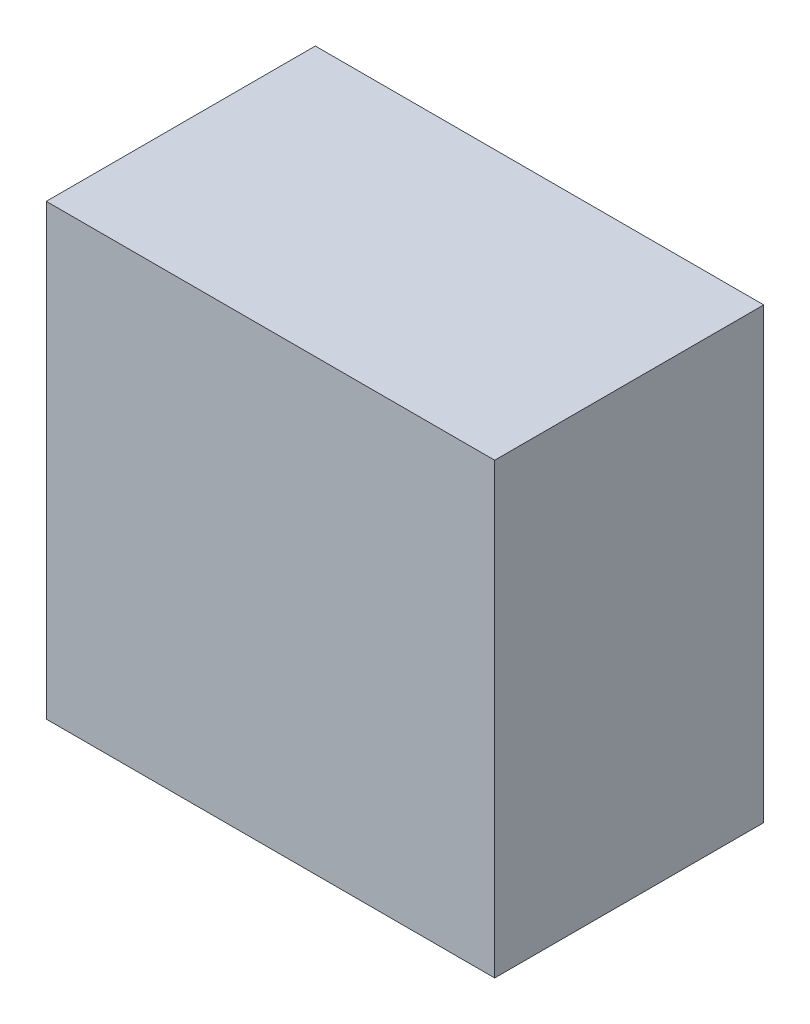
ISO-10303-21;
HEADER;
FILE_DESCRIPTION(('STEP AP214'),'2;1');
FILE_NAME('part.step','',(''),(''),'','','');
FILE_SCHEMA(('AUTOMOTIVE_DESIGN { 1 0 10303 214 1 1 1 1 }'));
ENDSEC;
DATA;
#1=APPLICATION_CONTEXT('core data for automotive mechanical design processes');
#2=APPLICATION_PROTOCOL_DEFINITION('international standard','automotive_design',2000,#1);
#3=PRODUCT_CONTEXT('',#1,'mechanical');
#4=PRODUCT('Part','Part','',(#3));
#5=PRODUCT_RELATED_PRODUCT_CATEGORY('part','',(#4));
#6=PRODUCT_DEFINITION_FORMATION('','',#4);
#7=PRODUCT_DEFINITION_CONTEXT('part definition',#1,'design');
#8=PRODUCT_DEFINITION('design','',#6,#7);
#9=PRODUCT_DEFINITION_SHAPE('','',#8);
#10=(LENGTH_UNIT() NAMED_UNIT(*) SI_UNIT(.MILLI.,.METRE.));
#11=(NAMED_UNIT(*) PLANE_ANGLE_UNIT() SI_UNIT($,.RADIAN.));
#12=(NAMED_UNIT(*) SI_UNIT($,.STERADIAN.) SOLID_ANGLE_UNIT());
#13=UNCERTAINTY_MEASURE_WITH_UNIT(LENGTH_MEASURE(1.E-05),#10,'distance_accuracy_value','');
#14=(GEOMETRIC_REPRESENTATION_CONTEXT(3) GLOBAL_UNCERTAINTY_ASSIGNED_CONTEXT((#13)) GLOBAL_UNIT_ASSIGNED_CONTEXT((#10,
#11,#12)) REPRESENTATION_CONTEXT('',''));
#15=CARTESIAN_POINT('',(0.,0.,0.));
#16=DIRECTION('',(0.,0.,1.));
#17=DIRECTION('',(1.,0.,0.));
#18=AXIS2_PLACEMENT_3D('',#15,#16,#17);
#19=CARTESIAN_POINT('',(37.5,37.5,22.5));
#20=DIRECTION('',(-1.,0.,0.));
#21=DIRECTION('',(0.,-1.,0.));
#22=AXIS2_PLACEMENT_3D('',#19,#20,#21);
#23=PLANE('',#22);
#24=DIRECTION('',(0.,1.,0.));
#25=VECTOR('',#24,1.);
#26=CARTESIAN_POINT('',(37.5,37.5,-22.5));
#27=LINE('',#26,#25);
#28=CARTESIAN_POINT('',(37.5,-37.5,-22.5));
#29=VERTEX_POINT('',#28);
#30=CARTESIAN_POINT('',(37.5,37.5,-22.5));
#31=VERTEX_POINT('',#30);
#32=EDGE_CURVE('E102',#29,#31,#27,.T.);
#33=ORIENTED_EDGE('',*,*,#32,.T.);
#34=DIRECTION('',(0.,0.,-1.));
#35=VECTOR('',#34,1.);
#36=CARTESIAN_POINT('',(37.5,37.5,22.5));
#37=LINE('',#36,#35);
#38=CARTESIAN_POINT('',(37.5,37.5,22.5));
#39=VERTEX_POINT('',#38);
#40=EDGE_CURVE('E11',#39,#31,#37,.T.);
#41=ORIENTED_EDGE('',*,*,#40,.F.);
#42=DIRECTION('',(0.,1.,0.));
#43=VECTOR('',#42,1.);
#44=CARTESIAN_POINT('',(37.5,37.5,22.5));
#45=LINE('',#44,#43);
#46=CARTESIAN_POINT('',(37.5,-37.5,22.5));
#47=VERTEX_POINT('',#46);
#48=EDGE_CURVE('E90',#47,#39,#45,.T.);
#49=ORIENTED_EDGE('',*,*,#48,.F.);
#50=DIRECTION('',(0.,0.,-1.));
#51=VECTOR('',#50,1.);
#52=CARTESIAN_POINT('',(37.5,-37.5,22.5));
#53=LINE('',#52,#51);
#54=EDGE_CURVE('E98',#47,#29,#53,.T.);
#55=ORIENTED_EDGE('',*,*,#54,.T.);
#56=EDGE_LOOP('',(#33,#41,#49,#55));
#57=FACE_BOUND('',#56,.T.);
#58=ADVANCED_FACE('F39',(#57),#23,.F.);
#59=CARTESIAN_POINT('',(-37.5,37.5,22.5));
#60=DIRECTION('',(0.,-1.,0.));
#61=DIRECTION('',(0.,0.,-1.));
#62=AXIS2_PLACEMENT_3D('',#59,#60,#61);
#63=PLANE('',#62);
#64=DIRECTION('',(-1.,0.,0.));
#65=VECTOR('',#64,1.);
#66=CARTESIAN_POINT('',(-37.5,37.5,-22.5));
#67=LINE('',#66,#65);
#68=CARTESIAN_POINT('',(-37.5,37.5,-22.5));
#69=VERTEX_POINT('',#68);
#70=EDGE_CURVE('E94',#31,#69,#67,.T.);
#71=ORIENTED_EDGE('',*,*,#70,.T.);
#72=DIRECTION('',(0.,0.,-1.));
#73=VECTOR('',#72,1.);
#74=CARTESIAN_POINT('',(-37.5,37.5,22.5));
#75=LINE('',#74,#73);
#76=CARTESIAN_POINT('',(-37.5,37.5,22.5));
#77=VERTEX_POINT('',#76);
#78=EDGE_CURVE('E47',#77,#69,#75,.T.);
#79=ORIENTED_EDGE('',*,*,#78,.F.);
#80=DIRECTION('',(-1.,0.,0.));
#81=VECTOR('',#80,1.);
#82=CARTESIAN_POINT('',(-37.5,37.5,22.5));
#83=LINE('',#82,#81);
#84=EDGE_CURVE('E85',#39,#77,#83,.T.);
#85=ORIENTED_EDGE('',*,*,#84,.F.);
#86=ORIENTED_EDGE('',*,*,#40,.T.);
#87=EDGE_LOOP('',(#71,#79,#85,#86));
#88=FACE_BOUND('',#87,.T.);
#89=ADVANCED_FACE('F93',(#88),#63,.F.);
#90=CARTESIAN_POINT('',(-37.5,37.5,22.5));
#91=DIRECTION('',(1.,0.,0.));
#92=DIRECTION('',(0.,1.,0.));
#93=AXIS2_PLACEMENT_3D('',#90,#91,#92);
#94=PLANE('',#93);
#95=DIRECTION('',(0.,-1.,0.));
#96=VECTOR('',#95,1.);
#97=CARTESIAN_POINT('',(-37.5,37.5,-22.5));
#98=LINE('',#97,#96);
#99=CARTESIAN_POINT('',(-37.5,-37.5,-22.5));
#100=VERTEX_POINT('',#99);
#101=EDGE_CURVE('E72',#69,#100,#98,.T.);
#102=ORIENTED_EDGE('',*,*,#101,.T.);
#103=DIRECTION('',(0.,0.,-1.));
#104=VECTOR('',#103,1.);
#105=CARTESIAN_POINT('',(-37.5,-37.5,22.5));
#106=LINE('',#105,#104);
#107=CARTESIAN_POINT('',(-37.5,-37.5,22.5));
#108=VERTEX_POINT('',#107);
#109=EDGE_CURVE('E95',#108,#100,#106,.T.);
#110=ORIENTED_EDGE('',*,*,#109,.F.);
#111=DIRECTION('',(0.,-1.,0.));
#112=VECTOR('',#111,1.);
#113=CARTESIAN_POINT('',(-37.5,37.5,22.5));
#114=LINE('',#113,#112);
#115=EDGE_CURVE('E88',#77,#108,#114,.T.);
#116=ORIENTED_EDGE('',*,*,#115,.F.);
#117=ORIENTED_EDGE('',*,*,#78,.T.);
#118=EDGE_LOOP('',(#102,#110,#116,#117));
#119=FACE_BOUND('',#118,.T.);
#120=ADVANCED_FACE('F96',(#119),#94,.F.);
#121=CARTESIAN_POINT('',(-37.5,-37.5,22.5));
#122=DIRECTION('',(0.,1.,0.));
#123=DIRECTION('',(0.,0.,1.));
#124=AXIS2_PLACEMENT_3D('',#121,#122,#123);
#125=PLANE('',#124);
#126=DIRECTION('',(1.,0.,0.));
#127=VECTOR('',#126,1.);
#128=CARTESIAN_POINT('',(-37.5,-37.5,-22.5));
#129=LINE('',#128,#127);
#130=EDGE_CURVE('E78',#100,#29,#129,.T.);
#131=ORIENTED_EDGE('',*,*,#130,.T.);
#132=ORIENTED_EDGE('',*,*,#54,.F.);
#133=DIRECTION('',(1.,0.,0.));
#134=VECTOR('',#133,1.);
#135=CARTESIAN_POINT('',(-37.5,-37.5,22.5));
#136=LINE('',#135,#134);
#137=EDGE_CURVE('E55',#108,#47,#136,.T.);
#138=ORIENTED_EDGE('',*,*,#137,.F.);
#139=ORIENTED_EDGE('',*,*,#109,.T.);
#140=EDGE_LOOP('',(#131,#132,#138,#139));
#141=FACE_BOUND('',#140,.T.);
#142=ADVANCED_FACE('F109',(#141),#125,.F.);
#143=CARTESIAN_POINT('',(0.,0.,22.5));
#144=DIRECTION('',(0.,0.,1.));
#145=DIRECTION('',(1.,0.,0.));
#146=AXIS2_PLACEMENT_3D('',#143,#144,#145);
#147=PLANE('',#146);
#148=ORIENTED_EDGE('',*,*,#48,.T.);
#149=ORIENTED_EDGE('',*,*,#84,.T.);
#150=ORIENTED_EDGE('',*,*,#115,.T.);
#151=ORIENTED_EDGE('',*,*,#137,.T.);
#152=EDGE_LOOP('',(#148,#149,#150,#151));
#153=FACE_BOUND('',#152,.T.);
#154=ADVANCED_FACE('F86',(#153),#147,.T.);
#155=CARTESIAN_POINT('',(0.,0.,-22.5));
#156=DIRECTION('',(0.,0.,1.));
#157=DIRECTION('',(1.,0.,0.));
#158=AXIS2_PLACEMENT_3D('',#155,#156,#157);
#159=PLANE('',#158);
#160=ORIENTED_EDGE('',*,*,#32,.F.);
#161=ORIENTED_EDGE('',*,*,#130,.F.);
#162=ORIENTED_EDGE('',*,*,#101,.F.);
#163=ORIENTED_EDGE('',*,*,#70,.F.);
#164=EDGE_LOOP('',(#160,#161,#162,#163));
#165=FACE_BOUND('',#164,.T.);
#166=ADVANCED_FACE('F112',(#165),#159,.F.);
#167=CLOSED_SHELL('',(#58,#89,#120,#142,#154,#166));
#168=MANIFOLD_SOLID_BREP('B2',#167);
#169=ADVANCED_BREP_SHAPE_REPRESENTATION('',(#18,#168),#14);
#170=SHAPE_DEFINITION_REPRESENTATION(#9,#169);
ENDSEC;
END-ISO-10303-21;
